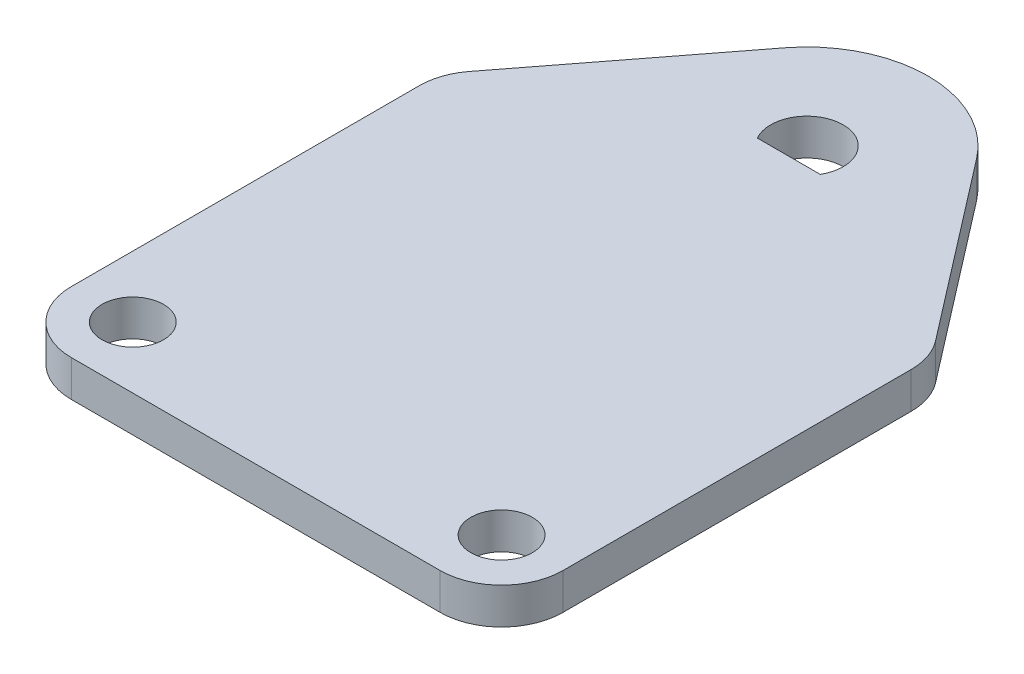
ISO-10303-21;
HEADER;
FILE_DESCRIPTION(('STEP AP214'),'2;1');
FILE_NAME('part.step','',(''),(''),'','','');
FILE_SCHEMA(('AUTOMOTIVE_DESIGN { 1 0 10303 214 1 1 1 1 }'));
ENDSEC;
DATA;
#1=APPLICATION_CONTEXT('core data for automotive mechanical design processes');
#2=APPLICATION_PROTOCOL_DEFINITION('international standard','automotive_design',2000,#1);
#3=PRODUCT_CONTEXT('',#1,'mechanical');
#4=PRODUCT('Part','Part','',(#3));
#5=PRODUCT_RELATED_PRODUCT_CATEGORY('part','',(#4));
#6=PRODUCT_DEFINITION_FORMATION('','',#4);
#7=PRODUCT_DEFINITION_CONTEXT('part definition',#1,'design');
#8=PRODUCT_DEFINITION('design','',#6,#7);
#9=PRODUCT_DEFINITION_SHAPE('','',#8);
#10=(LENGTH_UNIT() NAMED_UNIT(*) SI_UNIT(.MILLI.,.METRE.));
#11=(NAMED_UNIT(*) PLANE_ANGLE_UNIT() SI_UNIT($,.RADIAN.));
#12=(NAMED_UNIT(*) SI_UNIT($,.STERADIAN.) SOLID_ANGLE_UNIT());
#13=UNCERTAINTY_MEASURE_WITH_UNIT(LENGTH_MEASURE(1.E-05),#10,'distance_accuracy_value','');
#14=(GEOMETRIC_REPRESENTATION_CONTEXT(3) GLOBAL_UNCERTAINTY_ASSIGNED_CONTEXT((#13)) GLOBAL_UNIT_ASSIGNED_CONTEXT((#10,
#11,#12)) REPRESENTATION_CONTEXT('',''));
#15=CARTESIAN_POINT('',(0.,0.,0.));
#16=DIRECTION('',(0.,0.,1.));
#17=DIRECTION('',(1.,0.,0.));
#18=AXIS2_PLACEMENT_3D('',#15,#16,#17);
#19=CARTESIAN_POINT('',(62.9642123805414,6.,-48.4784772834186));
#20=DIRECTION('',(0.79235347699679,0.,-0.610062265257487));
#21=DIRECTION('',(-0.610062265257487,0.,-0.79235347699679));
#22=AXIS2_PLACEMENT_3D('',#19,#20,#21);
#23=PLANE('',#22);
#24=DIRECTION('',(-0.610062265257487,0.,-0.79235347699679));
#25=VECTOR('',#24,1.);
#26=CARTESIAN_POINT('',(62.9642123805414,7.5,-48.4784772834186));
#27=LINE('',#26,#25);
#28=CARTESIAN_POINT('',(418.134532746382,7.5,412.819416873597));
#29=VERTEX_POINT('',#28);
#30=CARTESIAN_POINT('',(412.455416438874,7.5,405.443337727604));
#31=VERTEX_POINT('',#30);
#32=EDGE_CURVE('E184',#29,#31,#27,.T.);
#33=ORIENTED_EDGE('',*,*,#32,.F.);
#34=DIRECTION('',(0.,1.,0.));
#35=VECTOR('',#34,1.);
#36=CARTESIAN_POINT('',(418.134532746382,6.,412.819416873597));
#37=LINE('',#36,#35);
#38=CARTESIAN_POINT('',(418.134532746382,6.,412.819416873597));
#39=VERTEX_POINT('',#38);
#40=EDGE_CURVE('E223',#29,#39,#37,.F.);
#41=ORIENTED_EDGE('',*,*,#40,.T.);
#42=DIRECTION('',(-0.610062265257487,0.,-0.79235347699679));
#43=VECTOR('',#42,1.);
#44=CARTESIAN_POINT('',(62.9642123805414,6.,-48.4784772834186));
#45=LINE('',#44,#43);
#46=CARTESIAN_POINT('',(412.455416438874,6.,405.443337727604));
#47=VERTEX_POINT('',#46);
#48=EDGE_CURVE('E156',#39,#47,#45,.T.);
#49=ORIENTED_EDGE('',*,*,#48,.T.);
#50=DIRECTION('',(0.,1.,0.));
#51=VECTOR('',#50,1.);
#52=CARTESIAN_POINT('',(412.455416438874,6.,405.443337727604));
#53=LINE('',#52,#51);
#54=EDGE_CURVE('E213',#47,#31,#53,.T.);
#55=ORIENTED_EDGE('',*,*,#54,.T.);
#56=EDGE_LOOP('',(#33,#41,#49,#55));
#57=FACE_BOUND('',#56,.T.);
#58=ADVANCED_FACE('F35',(#57),#23,.T.);
#59=CARTESIAN_POINT('',(418.653649053885,6.,-4.57479252483232E-12));
#60=DIRECTION('',(1.,0.,0.));
#61=DIRECTION('',(0.,0.,-1.));
#62=AXIS2_PLACEMENT_3D('',#59,#60,#61);
#63=PLANE('',#62);
#64=DIRECTION('',(0.,0.,-1.));
#65=VECTOR('',#64,1.);
#66=CARTESIAN_POINT('',(418.653649053885,6.,-4.57479252483232E-12));
#67=LINE('',#66,#65);
#68=CARTESIAN_POINT('',(418.65364905389,6.,428.733649053891));
#69=VERTEX_POINT('',#68);
#70=CARTESIAN_POINT('',(418.65364905389,6.,414.344572536741));
#71=VERTEX_POINT('',#70);
#72=EDGE_CURVE('E142',#69,#71,#67,.T.);
#73=ORIENTED_EDGE('',*,*,#72,.T.);
#74=DIRECTION('',(0.,1.,0.));
#75=VECTOR('',#74,1.);
#76=CARTESIAN_POINT('',(418.65364905389,6.,414.344572536741));
#77=LINE('',#76,#75);
#78=CARTESIAN_POINT('',(418.65364905389,7.5,414.344572536741));
#79=VERTEX_POINT('',#78);
#80=EDGE_CURVE('E203',#71,#79,#77,.T.);
#81=ORIENTED_EDGE('',*,*,#80,.T.);
#82=DIRECTION('',(0.,0.,-1.));
#83=VECTOR('',#82,1.);
#84=CARTESIAN_POINT('',(418.653649053885,7.5,-4.57479252483232E-12));
#85=LINE('',#84,#83);
#86=CARTESIAN_POINT('',(418.65364905389,7.5,428.733649053891));
#87=VERTEX_POINT('',#86);
#88=EDGE_CURVE('E145',#87,#79,#85,.T.);
#89=ORIENTED_EDGE('',*,*,#88,.F.);
#90=DIRECTION('',(0.,1.,0.));
#91=VECTOR('',#90,1.);
#92=CARTESIAN_POINT('',(418.65364905389,6.,428.733649053891));
#93=LINE('',#92,#91);
#94=EDGE_CURVE('E201',#69,#87,#93,.T.);
#95=ORIENTED_EDGE('',*,*,#94,.F.);
#96=EDGE_LOOP('',(#73,#81,#89,#95));
#97=FACE_BOUND('',#96,.T.);
#98=ADVANCED_FACE('F253',(#97),#63,.T.);
#99=CARTESIAN_POINT('',(416.11364905389,6.,428.733649053891));
#100=DIRECTION('',(0.,1.,0.));
#101=DIRECTION('',(0.,0.,1.));
#102=AXIS2_PLACEMENT_3D('',#99,#100,#101);
#103=CYLINDRICAL_SURFACE('',#102,2.54000000000001);
#104=CARTESIAN_POINT('',(416.11364905389,7.5,428.733649053891));
#105=DIRECTION('',(0.,1.,0.));
#106=DIRECTION('',(0.,0.,1.));
#107=AXIS2_PLACEMENT_3D('',#104,#105,#106);
#108=CIRCLE('',#107,2.54000000000001);
#109=CARTESIAN_POINT('',(416.11364905389,7.5,431.273649053891));
#110=VERTEX_POINT('',#109);
#111=EDGE_CURVE('E148',#87,#110,#108,.F.);
#112=ORIENTED_EDGE('',*,*,#111,.T.);
#113=DIRECTION('',(0.,1.,0.));
#114=VECTOR('',#113,1.);
#115=CARTESIAN_POINT('',(416.11364905389,6.,431.273649053891));
#116=LINE('',#115,#114);
#117=CARTESIAN_POINT('',(416.11364905389,6.,431.273649053891));
#118=VERTEX_POINT('',#117);
#119=EDGE_CURVE('E204',#118,#110,#116,.T.);
#120=ORIENTED_EDGE('',*,*,#119,.F.);
#121=CARTESIAN_POINT('',(416.11364905389,6.,428.733649053891));
#122=DIRECTION('',(0.,1.,0.));
#123=DIRECTION('',(0.,0.,1.));
#124=AXIS2_PLACEMENT_3D('',#121,#122,#123);
#125=CIRCLE('',#124,2.54000000000001);
#126=EDGE_CURVE('E171',#69,#118,#125,.F.);
#127=ORIENTED_EDGE('',*,*,#126,.F.);
#128=ORIENTED_EDGE('',*,*,#94,.T.);
#129=EDGE_LOOP('',(#112,#120,#127,#128));
#130=FACE_BOUND('',#129,.T.);
#131=ADVANCED_FACE('F258',(#130),#103,.T.);
#132=CARTESIAN_POINT('',(-1.57089873718416E-12,6.,431.27364905389));
#133=DIRECTION('',(0.,0.,1.));
#134=DIRECTION('',(1.,0.,0.));
#135=AXIS2_PLACEMENT_3D('',#132,#133,#134);
#136=PLANE('',#135);
#137=DIRECTION('',(1.,0.,0.));
#138=VECTOR('',#137,1.);
#139=CARTESIAN_POINT('',(-1.57089873718416E-12,7.5,431.27364905389));
#140=LINE('',#139,#138);
#141=CARTESIAN_POINT('',(400.87364905389,7.5,431.273649053891));
#142=VERTEX_POINT('',#141);
#143=EDGE_CURVE('E196',#142,#110,#140,.T.);
#144=ORIENTED_EDGE('',*,*,#143,.F.);
#145=DIRECTION('',(0.,1.,0.));
#146=VECTOR('',#145,1.);
#147=CARTESIAN_POINT('',(400.87364905389,6.,431.273649053891));
#148=LINE('',#147,#146);
#149=CARTESIAN_POINT('',(400.87364905389,6.,431.273649053891));
#150=VERTEX_POINT('',#149);
#151=EDGE_CURVE('E206',#150,#142,#148,.T.);
#152=ORIENTED_EDGE('',*,*,#151,.F.);
#153=DIRECTION('',(1.,0.,0.));
#154=VECTOR('',#153,1.);
#155=CARTESIAN_POINT('',(-1.57089873718416E-12,6.,431.27364905389));
#156=LINE('',#155,#154);
#157=EDGE_CURVE('E168',#150,#118,#156,.T.);
#158=ORIENTED_EDGE('',*,*,#157,.T.);
#159=ORIENTED_EDGE('',*,*,#119,.T.);
#160=EDGE_LOOP('',(#144,#152,#158,#159));
#161=FACE_BOUND('',#160,.T.);
#162=ADVANCED_FACE('F301',(#161),#136,.T.);
#163=CARTESIAN_POINT('',(400.87364905389,6.,428.733649053891));
#164=DIRECTION('',(0.,1.,0.));
#165=DIRECTION('',(0.,0.,1.));
#166=AXIS2_PLACEMENT_3D('',#163,#164,#165);
#167=CYLINDRICAL_SURFACE('',#166,2.53999999999996);
#168=CARTESIAN_POINT('',(400.87364905389,7.5,428.733649053891));
#169=DIRECTION('',(0.,1.,0.));
#170=DIRECTION('',(0.,0.,1.));
#171=AXIS2_PLACEMENT_3D('',#168,#169,#170);
#172=CIRCLE('',#171,2.53999999999996);
#173=CARTESIAN_POINT('',(398.33364905389,7.5,428.733649053891));
#174=VERTEX_POINT('',#173);
#175=EDGE_CURVE('E193',#174,#142,#172,.T.);
#176=ORIENTED_EDGE('',*,*,#175,.F.);
#177=DIRECTION('',(0.,1.,0.));
#178=VECTOR('',#177,1.);
#179=CARTESIAN_POINT('',(398.33364905389,6.,428.733649053891));
#180=LINE('',#179,#178);
#181=CARTESIAN_POINT('',(398.33364905389,6.,428.733649053891));
#182=VERTEX_POINT('',#181);
#183=EDGE_CURVE('E208',#182,#174,#180,.T.);
#184=ORIENTED_EDGE('',*,*,#183,.F.);
#185=CARTESIAN_POINT('',(400.87364905389,6.,428.733649053891));
#186=DIRECTION('',(0.,1.,0.));
#187=DIRECTION('',(0.,0.,1.));
#188=AXIS2_PLACEMENT_3D('',#185,#186,#187);
#189=CIRCLE('',#188,2.53999999999996);
#190=EDGE_CURVE('E165',#182,#150,#189,.T.);
#191=ORIENTED_EDGE('',*,*,#190,.T.);
#192=ORIENTED_EDGE('',*,*,#151,.T.);
#193=EDGE_LOOP('',(#176,#184,#191,#192));
#194=FACE_BOUND('',#193,.T.);
#195=ADVANCED_FACE('F265',(#194),#167,.T.);
#196=CARTESIAN_POINT('',(398.333649053888,6.,-1.45091597330244E-12));
#197=DIRECTION('',(1.,0.,0.));
#198=DIRECTION('',(0.,0.,-1.));
#199=AXIS2_PLACEMENT_3D('',#196,#197,#198);
#200=PLANE('',#199);
#201=DIRECTION('',(0.,0.,-1.));
#202=VECTOR('',#201,1.);
#203=CARTESIAN_POINT('',(398.333649053888,7.5,-1.45091597330244E-12));
#204=LINE('',#203,#202);
#205=CARTESIAN_POINT('',(398.33364905389,7.5,414.344572536741));
#206=VERTEX_POINT('',#205);
#207=EDGE_CURVE('E191',#174,#206,#204,.T.);
#208=ORIENTED_EDGE('',*,*,#207,.T.);
#209=DIRECTION('',(0.,1.,0.));
#210=VECTOR('',#209,1.);
#211=CARTESIAN_POINT('',(398.33364905389,6.,414.344572536741));
#212=LINE('',#211,#210);
#213=CARTESIAN_POINT('',(398.33364905389,6.,414.344572536741));
#214=VERTEX_POINT('',#213);
#215=EDGE_CURVE('E11',#206,#214,#212,.F.);
#216=ORIENTED_EDGE('',*,*,#215,.T.);
#217=DIRECTION('',(0.,0.,-1.));
#218=VECTOR('',#217,1.);
#219=CARTESIAN_POINT('',(398.333649053888,6.,-1.45091597330244E-12));
#220=LINE('',#219,#218);
#221=EDGE_CURVE('E163',#182,#214,#220,.T.);
#222=ORIENTED_EDGE('',*,*,#221,.F.);
#223=ORIENTED_EDGE('',*,*,#183,.T.);
#224=EDGE_LOOP('',(#208,#216,#222,#223));
#225=FACE_BOUND('',#224,.T.);
#226=ADVANCED_FACE('F266',(#225),#200,.F.);
#227=CARTESIAN_POINT('',(449.960047626036,6.,346.44089273205));
#228=DIRECTION('',(0.792353476996784,0.,0.610062265257495));
#229=DIRECTION('',(0.610062265257495,0.,-0.792353476996784));
#230=AXIS2_PLACEMENT_3D('',#227,#228,#229);
#231=PLANE('',#230);
#232=DIRECTION('',(0.610062265257495,0.,-0.792353476996784));
#233=VECTOR('',#232,1.);
#234=CARTESIAN_POINT('',(449.960047626036,6.,346.44089273205));
#235=LINE('',#234,#233);
#236=CARTESIAN_POINT('',(398.852765361398,6.,412.819416873597));
#237=VERTEX_POINT('',#236);
#238=CARTESIAN_POINT('',(404.531881668906,6.,405.443337727604));
#239=VERTEX_POINT('',#238);
#240=EDGE_CURVE('E161',#237,#239,#235,.T.);
#241=ORIENTED_EDGE('',*,*,#240,.F.);
#242=DIRECTION('',(0.,1.,0.));
#243=VECTOR('',#242,1.);
#244=CARTESIAN_POINT('',(398.852765361398,6.,412.819416873597));
#245=LINE('',#244,#243);
#246=CARTESIAN_POINT('',(398.852765361398,7.5,412.819416873597));
#247=VERTEX_POINT('',#246);
#248=EDGE_CURVE('E43',#237,#247,#245,.T.);
#249=ORIENTED_EDGE('',*,*,#248,.T.);
#250=DIRECTION('',(0.610062265257495,0.,-0.792353476996784));
#251=VECTOR('',#250,1.);
#252=CARTESIAN_POINT('',(449.960047626036,7.5,346.44089273205));
#253=LINE('',#252,#251);
#254=CARTESIAN_POINT('',(404.531881668906,7.5,405.443337727604));
#255=VERTEX_POINT('',#254);
#256=EDGE_CURVE('E189',#247,#255,#253,.T.);
#257=ORIENTED_EDGE('',*,*,#256,.T.);
#258=DIRECTION('',(0.,1.,0.));
#259=VECTOR('',#258,1.);
#260=CARTESIAN_POINT('',(404.531881668906,6.,405.443337727604));
#261=LINE('',#260,#259);
#262=EDGE_CURVE('E210',#239,#255,#261,.T.);
#263=ORIENTED_EDGE('',*,*,#262,.F.);
#264=EDGE_LOOP('',(#241,#249,#257,#263));
#265=FACE_BOUND('',#264,.T.);
#266=ADVANCED_FACE('F231',(#265),#231,.F.);
#267=CARTESIAN_POINT('',(408.49364905389,6.,408.493649053891));
#268=DIRECTION('',(0.,1.,0.));
#269=DIRECTION('',(0.,0.,1.));
#270=AXIS2_PLACEMENT_3D('',#267,#268,#269);
#271=CYLINDRICAL_SURFACE('',#270,1.50000000000001);
#272=CARTESIAN_POINT('',(408.49364905389,7.5,408.493649053891));
#273=DIRECTION('',(0.,1.,0.));
#274=DIRECTION('',(0.,0.,1.));
#275=AXIS2_PLACEMENT_3D('',#272,#273,#274);
#276=CIRCLE('',#275,1.50000000000001);
#277=CARTESIAN_POINT('',(409.792687159567,7.5,409.243649053891));
#278=VERTEX_POINT('',#277);
#279=CARTESIAN_POINT('',(407.194610948213,7.5,409.243649053891));
#280=VERTEX_POINT('',#279);
#281=EDGE_CURVE('E175',#278,#280,#276,.T.);
#282=ORIENTED_EDGE('',*,*,#281,.T.);
#283=DIRECTION('',(0.,1.,0.));
#284=VECTOR('',#283,1.);
#285=CARTESIAN_POINT('',(407.194610948213,6.,409.243649053891));
#286=LINE('',#285,#284);
#287=CARTESIAN_POINT('',(407.194610948213,6.,409.243649053891));
#288=VERTEX_POINT('',#287);
#289=EDGE_CURVE('E141',#288,#280,#286,.T.);
#290=ORIENTED_EDGE('',*,*,#289,.F.);
#291=CARTESIAN_POINT('',(408.49364905389,6.,408.493649053891));
#292=DIRECTION('',(0.,1.,0.));
#293=DIRECTION('',(0.,0.,1.));
#294=AXIS2_PLACEMENT_3D('',#291,#292,#293);
#295=CIRCLE('',#294,1.50000000000001);
#296=CARTESIAN_POINT('',(409.792687159567,6.,409.243649053891));
#297=VERTEX_POINT('',#296);
#298=EDGE_CURVE('E128',#297,#288,#295,.T.);
#299=ORIENTED_EDGE('',*,*,#298,.F.);
#300=DIRECTION('',(0.,1.,0.));
#301=VECTOR('',#300,1.);
#302=CARTESIAN_POINT('',(409.792687159567,6.,409.243649053891));
#303=LINE('',#302,#301);
#304=EDGE_CURVE('E135',#297,#278,#303,.T.);
#305=ORIENTED_EDGE('',*,*,#304,.T.);
#306=EDGE_LOOP('',(#282,#290,#299,#305));
#307=FACE_BOUND('',#306,.T.);
#308=ADVANCED_FACE('F144',(#307),#271,.F.);
#309=CARTESIAN_POINT('',(416.11364905389,6.,428.733649053891));
#310=DIRECTION('',(0.,1.,0.));
#311=DIRECTION('',(0.,0.,1.));
#312=AXIS2_PLACEMENT_3D('',#309,#310,#311);
#313=CYLINDRICAL_SURFACE('',#312,1.26999999999997);
#314=CARTESIAN_POINT('',(416.11364905389,6.,428.733649053891));
#315=DIRECTION('',(0.,1.,0.));
#316=DIRECTION('',(0.,0.,1.));
#317=AXIS2_PLACEMENT_3D('',#314,#315,#316);
#318=CIRCLE('',#317,1.26999999999997);
#319=CARTESIAN_POINT('',(416.11364905389,6.,430.003649053891));
#320=VERTEX_POINT('',#319);
#321=EDGE_CURVE('E153',#320,#320,#318,.T.);
#322=ORIENTED_EDGE('',*,*,#321,.F.);
#323=EDGE_LOOP('',(#322));
#324=FACE_BOUND('',#323,.T.);
#325=CARTESIAN_POINT('',(416.11364905389,7.5,428.733649053891));
#326=DIRECTION('',(0.,1.,0.));
#327=DIRECTION('',(0.,0.,1.));
#328=AXIS2_PLACEMENT_3D('',#325,#326,#327);
#329=CIRCLE('',#328,1.26999999999997);
#330=CARTESIAN_POINT('',(416.11364905389,7.5,430.003649053891));
#331=VERTEX_POINT('',#330);
#332=EDGE_CURVE('E181',#331,#331,#329,.T.);
#333=ORIENTED_EDGE('',*,*,#332,.T.);
#334=EDGE_LOOP('',(#333));
#335=FACE_BOUND('',#334,.T.);
#336=ADVANCED_FACE('F280',(#324,#335),#313,.F.);
#337=CARTESIAN_POINT('',(400.87364905389,6.,428.733649053891));
#338=DIRECTION('',(0.,1.,0.));
#339=DIRECTION('',(0.,0.,1.));
#340=AXIS2_PLACEMENT_3D('',#337,#338,#339);
#341=CYLINDRICAL_SURFACE('',#340,1.27000000069042);
#342=CARTESIAN_POINT('',(400.87364905389,6.,428.733649053891));
#343=DIRECTION('',(0.,1.,0.));
#344=DIRECTION('',(0.,0.,1.));
#345=AXIS2_PLACEMENT_3D('',#342,#343,#344);
#346=CIRCLE('',#345,1.27000000069042);
#347=CARTESIAN_POINT('',(400.87364905389,6.,430.003649054582));
#348=VERTEX_POINT('',#347);
#349=EDGE_CURVE('E132',#348,#348,#346,.F.);
#350=ORIENTED_EDGE('',*,*,#349,.T.);
#351=EDGE_LOOP('',(#350));
#352=FACE_BOUND('',#351,.T.);
#353=CARTESIAN_POINT('',(400.87364905389,7.5,428.733649053891));
#354=DIRECTION('',(0.,1.,0.));
#355=DIRECTION('',(0.,0.,1.));
#356=AXIS2_PLACEMENT_3D('',#353,#354,#355);
#357=CIRCLE('',#356,1.27000000069042);
#358=CARTESIAN_POINT('',(400.87364905389,7.5,430.003649054582));
#359=VERTEX_POINT('',#358);
#360=EDGE_CURVE('E178',#359,#359,#357,.F.);
#361=ORIENTED_EDGE('',*,*,#360,.F.);
#362=EDGE_LOOP('',(#361));
#363=FACE_BOUND('',#362,.T.);
#364=ADVANCED_FACE('F283',(#352,#363),#341,.F.);
#365=CARTESIAN_POINT('',(-8.74400296411181E-12,6.,409.243649053883));
#366=DIRECTION('',(0.,0.,1.));
#367=DIRECTION('',(1.,0.,0.));
#368=AXIS2_PLACEMENT_3D('',#365,#366,#367);
#369=PLANE('',#368);
#370=DIRECTION('',(1.,0.,0.));
#371=VECTOR('',#370,1.);
#372=CARTESIAN_POINT('',(-8.74400296411181E-12,7.5,409.243649053883));
#373=LINE('',#372,#371);
#374=EDGE_CURVE('E137',#280,#278,#373,.T.);
#375=ORIENTED_EDGE('',*,*,#374,.T.);
#376=ORIENTED_EDGE('',*,*,#304,.F.);
#377=DIRECTION('',(1.,0.,0.));
#378=VECTOR('',#377,1.);
#379=CARTESIAN_POINT('',(-8.74400296411181E-12,6.,409.243649053883));
#380=LINE('',#379,#378);
#381=EDGE_CURVE('E123',#288,#297,#380,.T.);
#382=ORIENTED_EDGE('',*,*,#381,.F.);
#383=ORIENTED_EDGE('',*,*,#289,.T.);
#384=EDGE_LOOP('',(#375,#376,#382,#383));
#385=FACE_BOUND('',#384,.T.);
#386=ADVANCED_FACE('F136',(#385),#369,.F.);
#387=CARTESIAN_POINT('',(408.49364905389,6.,408.493649053891));
#388=DIRECTION('',(0.,1.,0.));
#389=DIRECTION('',(0.,0.,1.));
#390=AXIS2_PLACEMENT_3D('',#387,#388,#389);
#391=CYLINDRICAL_SURFACE('',#390,4.99999999999999);
#392=CARTESIAN_POINT('',(408.49364905389,7.5,408.493649053891));
#393=DIRECTION('',(0.,1.,0.));
#394=DIRECTION('',(0.,0.,1.));
#395=AXIS2_PLACEMENT_3D('',#392,#393,#394);
#396=CIRCLE('',#395,4.99999999999999);
#397=EDGE_CURVE('E186',#31,#255,#396,.T.);
#398=ORIENTED_EDGE('',*,*,#397,.F.);
#399=ORIENTED_EDGE('',*,*,#54,.F.);
#400=CARTESIAN_POINT('',(408.49364905389,6.,408.493649053891));
#401=DIRECTION('',(0.,1.,0.));
#402=DIRECTION('',(0.,0.,1.));
#403=AXIS2_PLACEMENT_3D('',#400,#401,#402);
#404=CIRCLE('',#403,4.99999999999999);
#405=EDGE_CURVE('E158',#47,#239,#404,.T.);
#406=ORIENTED_EDGE('',*,*,#405,.T.);
#407=ORIENTED_EDGE('',*,*,#262,.T.);
#408=EDGE_LOOP('',(#398,#399,#406,#407));
#409=FACE_BOUND('',#408,.T.);
#410=ADVANCED_FACE('F241',(#409),#391,.T.);
#411=CARTESIAN_POINT('',(0.,6.,0.));
#412=DIRECTION('',(0.,1.,0.));
#413=DIRECTION('',(0.,0.,1.));
#414=AXIS2_PLACEMENT_3D('',#411,#412,#413);
#415=PLANE('',#414);
#416=ORIENTED_EDGE('',*,*,#298,.T.);
#417=ORIENTED_EDGE('',*,*,#381,.T.);
#418=EDGE_LOOP('',(#416,#417));
#419=FACE_BOUND('',#418,.T.);
#420=ORIENTED_EDGE('',*,*,#349,.F.);
#421=EDGE_LOOP('',(#420));
#422=FACE_BOUND('',#421,.T.);
#423=ORIENTED_EDGE('',*,*,#321,.T.);
#424=EDGE_LOOP('',(#423));
#425=FACE_BOUND('',#424,.T.);
#426=ORIENTED_EDGE('',*,*,#48,.F.);
#427=CARTESIAN_POINT('',(416.15364905389,6.,414.344572536741));
#428=DIRECTION('',(0.,1.,0.));
#429=DIRECTION('',(0.,0.,1.));
#430=AXIS2_PLACEMENT_3D('',#427,#428,#429);
#431=CIRCLE('',#430,2.5);
#432=EDGE_CURVE('E226',#39,#71,#431,.F.);
#433=ORIENTED_EDGE('',*,*,#432,.T.);
#434=ORIENTED_EDGE('',*,*,#72,.F.);
#435=ORIENTED_EDGE('',*,*,#126,.T.);
#436=ORIENTED_EDGE('',*,*,#157,.F.);
#437=ORIENTED_EDGE('',*,*,#190,.F.);
#438=ORIENTED_EDGE('',*,*,#221,.T.);
#439=CARTESIAN_POINT('',(400.83364905389,6.,414.344572536741));
#440=DIRECTION('',(0.,1.,0.));
#441=DIRECTION('',(0.,0.,1.));
#442=AXIS2_PLACEMENT_3D('',#439,#440,#441);
#443=CIRCLE('',#442,2.5);
#444=EDGE_CURVE('E50',#214,#237,#443,.F.);
#445=ORIENTED_EDGE('',*,*,#444,.T.);
#446=ORIENTED_EDGE('',*,*,#240,.T.);
#447=ORIENTED_EDGE('',*,*,#405,.F.);
#448=EDGE_LOOP('',(#426,#433,#434,#435,#436,#437,#438,#445,#446,#447));
#449=FACE_BOUND('',#448,.T.);
#450=ADVANCED_FACE('F125',(#419,#422,#425,#449),#415,.F.);
#451=CARTESIAN_POINT('',(0.,7.5,0.));
#452=DIRECTION('',(0.,1.,0.));
#453=DIRECTION('',(0.,0.,1.));
#454=AXIS2_PLACEMENT_3D('',#451,#452,#453);
#455=PLANE('',#454);
#456=ORIENTED_EDGE('',*,*,#281,.F.);
#457=ORIENTED_EDGE('',*,*,#374,.F.);
#458=EDGE_LOOP('',(#456,#457));
#459=FACE_BOUND('',#458,.T.);
#460=ORIENTED_EDGE('',*,*,#360,.T.);
#461=EDGE_LOOP('',(#460));
#462=FACE_BOUND('',#461,.T.);
#463=ORIENTED_EDGE('',*,*,#332,.F.);
#464=EDGE_LOOP('',(#463));
#465=FACE_BOUND('',#464,.T.);
#466=ORIENTED_EDGE('',*,*,#88,.T.);
#467=CARTESIAN_POINT('',(416.15364905389,7.5,414.344572536741));
#468=DIRECTION('',(0.,1.,0.));
#469=DIRECTION('',(0.,0.,1.));
#470=AXIS2_PLACEMENT_3D('',#467,#468,#469);
#471=CIRCLE('',#470,2.5);
#472=EDGE_CURVE('E221',#79,#29,#471,.T.);
#473=ORIENTED_EDGE('',*,*,#472,.T.);
#474=ORIENTED_EDGE('',*,*,#32,.T.);
#475=ORIENTED_EDGE('',*,*,#397,.T.);
#476=ORIENTED_EDGE('',*,*,#256,.F.);
#477=CARTESIAN_POINT('',(400.83364905389,7.5,414.344572536741));
#478=DIRECTION('',(0.,1.,0.));
#479=DIRECTION('',(0.,0.,1.));
#480=AXIS2_PLACEMENT_3D('',#477,#478,#479);
#481=CIRCLE('',#480,2.5);
#482=EDGE_CURVE('E219',#247,#206,#481,.T.);
#483=ORIENTED_EDGE('',*,*,#482,.T.);
#484=ORIENTED_EDGE('',*,*,#207,.F.);
#485=ORIENTED_EDGE('',*,*,#175,.T.);
#486=ORIENTED_EDGE('',*,*,#143,.T.);
#487=ORIENTED_EDGE('',*,*,#111,.F.);
#488=EDGE_LOOP('',(#466,#473,#474,#475,#476,#483,#484,#485,#486,#487));
#489=FACE_BOUND('',#488,.T.);
#490=ADVANCED_FACE('F235',(#459,#462,#465,#489),#455,.T.);
#491=CARTESIAN_POINT('',(416.15364905389,6.,414.344572536741));
#492=DIRECTION('',(0.,1.,0.));
#493=DIRECTION('',(0.,0.,1.));
#494=AXIS2_PLACEMENT_3D('',#491,#492,#493);
#495=CYLINDRICAL_SURFACE('',#494,2.5);
#496=ORIENTED_EDGE('',*,*,#432,.F.);
#497=ORIENTED_EDGE('',*,*,#40,.F.);
#498=ORIENTED_EDGE('',*,*,#472,.F.);
#499=ORIENTED_EDGE('',*,*,#80,.F.);
#500=EDGE_LOOP('',(#496,#497,#498,#499));
#501=FACE_BOUND('',#500,.T.);
#502=ADVANCED_FACE('F250',(#501),#495,.T.);
#503=CARTESIAN_POINT('',(400.83364905389,6.,414.344572536741));
#504=DIRECTION('',(0.,1.,0.));
#505=DIRECTION('',(0.,0.,1.));
#506=AXIS2_PLACEMENT_3D('',#503,#504,#505);
#507=CYLINDRICAL_SURFACE('',#506,2.5);
#508=ORIENTED_EDGE('',*,*,#444,.F.);
#509=ORIENTED_EDGE('',*,*,#215,.F.);
#510=ORIENTED_EDGE('',*,*,#482,.F.);
#511=ORIENTED_EDGE('',*,*,#248,.F.);
#512=EDGE_LOOP('',(#508,#509,#510,#511));
#513=FACE_BOUND('',#512,.T.);
#514=ADVANCED_FACE('F37',(#513),#507,.T.);
#515=CLOSED_SHELL('',(#58,#98,#131,#162,#195,#226,#266,#308,#336,#364,#386,#410,#450,#490,#502,#514));
#516=MANIFOLD_SOLID_BREP('B2',#515);
#517=ADVANCED_BREP_SHAPE_REPRESENTATION('',(#18,#516),#14);
#518=SHAPE_DEFINITION_REPRESENTATION(#9,#517);
ENDSEC;
END-ISO-10303-21;
